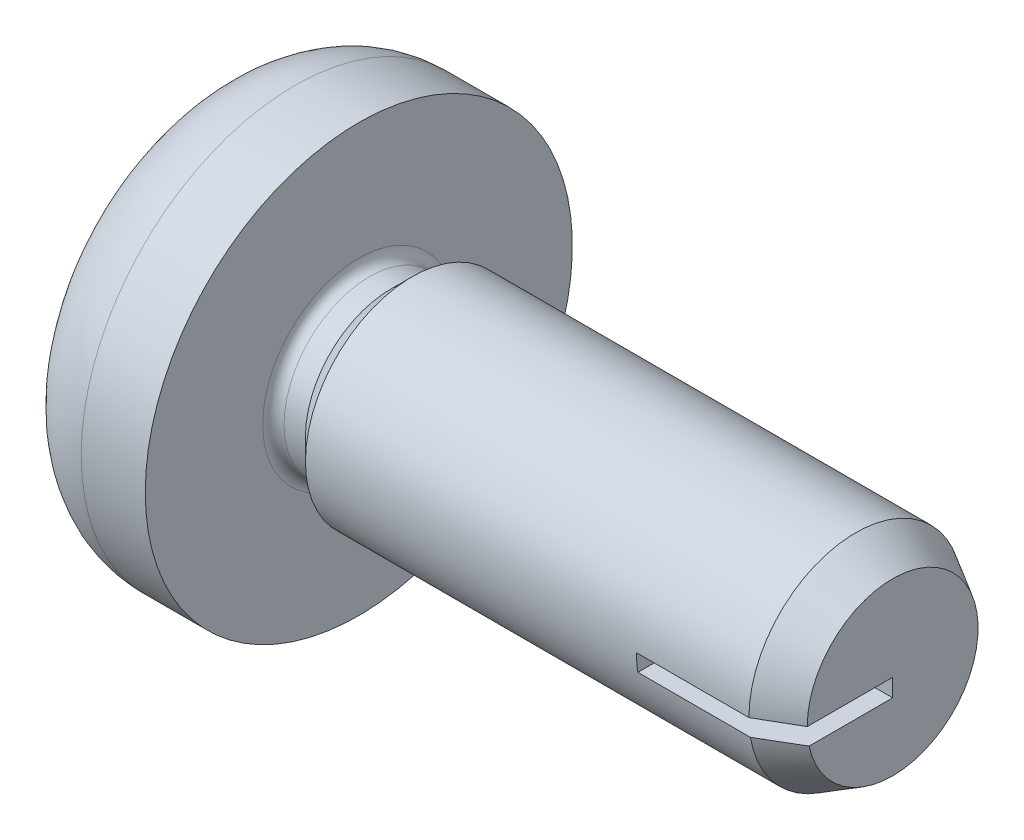
ISO-10303-21;
HEADER;
FILE_DESCRIPTION(('STEP AP214'),'2;1');
FILE_NAME('part.step','',(''),(''),'','','');
FILE_SCHEMA(('AUTOMOTIVE_DESIGN { 1 0 10303 214 1 1 1 1 }'));
ENDSEC;
DATA;
#1=APPLICATION_CONTEXT('core data for automotive mechanical design processes');
#2=APPLICATION_PROTOCOL_DEFINITION('international standard','automotive_design',2000,#1);
#3=PRODUCT_CONTEXT('',#1,'mechanical');
#4=PRODUCT('Part','Part','',(#3));
#5=PRODUCT_RELATED_PRODUCT_CATEGORY('part','',(#4));
#6=PRODUCT_DEFINITION_FORMATION('','',#4);
#7=PRODUCT_DEFINITION_CONTEXT('part definition',#1,'design');
#8=PRODUCT_DEFINITION('design','',#6,#7);
#9=PRODUCT_DEFINITION_SHAPE('','',#8);
#10=(LENGTH_UNIT() NAMED_UNIT(*) SI_UNIT(.MILLI.,.METRE.));
#11=(NAMED_UNIT(*) PLANE_ANGLE_UNIT() SI_UNIT($,.RADIAN.));
#12=(NAMED_UNIT(*) SI_UNIT($,.STERADIAN.) SOLID_ANGLE_UNIT());
#13=UNCERTAINTY_MEASURE_WITH_UNIT(LENGTH_MEASURE(1.E-05),#10,'distance_accuracy_value','');
#14=(GEOMETRIC_REPRESENTATION_CONTEXT(3) GLOBAL_UNCERTAINTY_ASSIGNED_CONTEXT((#13)) GLOBAL_UNIT_ASSIGNED_CONTEXT((#10,
#11,#12)) REPRESENTATION_CONTEXT('',''));
#15=CARTESIAN_POINT('',(0.,0.,0.));
#16=DIRECTION('',(0.,0.,1.));
#17=DIRECTION('',(1.,0.,0.));
#18=AXIS2_PLACEMENT_3D('',#15,#16,#17);
#19=CARTESIAN_POINT('',(0.,0.,0.));
#20=DIRECTION('',(-1.,0.,0.));
#21=DIRECTION('',(0.,0.,1.));
#22=AXIS2_PLACEMENT_3D('',#19,#20,#21);
#23=CYLINDRICAL_SURFACE('',#22,4.);
#24=CARTESIAN_POINT('',(7.6,0.,0.));
#25=DIRECTION('',(-1.,0.,0.));
#26=DIRECTION('',(0.,0.,1.));
#27=AXIS2_PLACEMENT_3D('',#24,#25,#26);
#28=CIRCLE('',#27,4.);
#29=CARTESIAN_POINT('',(7.6,0.,4.));
#30=VERTEX_POINT('',#29);
#31=EDGE_CURVE('E232',#30,#30,#28,.T.);
#32=ORIENTED_EDGE('',*,*,#31,.F.);
#33=EDGE_LOOP('',(#32));
#34=FACE_BOUND('',#33,.T.);
#35=DIRECTION('',(-1.,0.,0.));
#36=VECTOR('',#35,1.);
#37=CARTESIAN_POINT('',(0.,0.,4.));
#38=LINE('',#37,#36);
#39=CARTESIAN_POINT('',(24.2143593539449,0.,4.));
#40=VERTEX_POINT('',#39);
#41=CARTESIAN_POINT('',(20.,0.,4.));
#42=VERTEX_POINT('',#41);
#43=EDGE_CURVE('E374',#40,#42,#38,.T.);
#44=ORIENTED_EDGE('',*,*,#43,.F.);
#45=CARTESIAN_POINT('',(24.2143593539449,0.,0.));
#46=DIRECTION('',(-1.,0.,0.));
#47=DIRECTION('',(0.,0.,1.));
#48=AXIS2_PLACEMENT_3D('',#45,#46,#47);
#49=CIRCLE('',#48,4.);
#50=CARTESIAN_POINT('',(24.2143593539449,-0.666666666666667,3.94405318873308));
#51=VERTEX_POINT('',#50);
#52=EDGE_CURVE('E371',#40,#51,#49,.T.);
#53=ORIENTED_EDGE('',*,*,#52,.T.);
#54=DIRECTION('',(-1.,0.,0.));
#55=VECTOR('',#54,1.);
#56=CARTESIAN_POINT('',(0.,-0.66666666666667,3.94405318873308));
#57=LINE('',#56,#55);
#58=CARTESIAN_POINT('',(20.,-0.666666666666667,3.94405318873308));
#59=VERTEX_POINT('',#58);
#60=EDGE_CURVE('E378',#59,#51,#57,.F.);
#61=ORIENTED_EDGE('',*,*,#60,.F.);
#62=CARTESIAN_POINT('',(20.,0.,0.));
#63=DIRECTION('',(1.,0.,0.));
#64=DIRECTION('',(0.,0.,-1.));
#65=AXIS2_PLACEMENT_3D('',#62,#63,#64);
#66=CIRCLE('',#65,4.);
#67=EDGE_CURVE('E42',#42,#59,#66,.T.);
#68=ORIENTED_EDGE('',*,*,#67,.F.);
#69=EDGE_LOOP('',(#44,#53,#61,#68));
#70=FACE_BOUND('',#69,.T.);
#71=ADVANCED_FACE('F68',(#34,#70),#23,.T.);
#72=CARTESIAN_POINT('',(24.2143593539449,0.,0.));
#73=DIRECTION('',(-1.,0.,0.));
#74=DIRECTION('',(0.,0.,1.));
#75=AXIS2_PLACEMENT_3D('',#72,#73,#74);
#76=CONICAL_SURFACE('',#75,4.,0.523598775598293);
#77=ORIENTED_EDGE('',*,*,#52,.F.);
#78=DIRECTION('',(-0.866025403784441,0.,0.499999999999995));
#79=VECTOR('',#78,1.);
#80=CARTESIAN_POINT('',(31.1425625842205,0.,0.));
#81=LINE('',#80,#79);
#82=CARTESIAN_POINT('',(25.6,0.,3.2));
#83=VERTEX_POINT('',#82);
#84=EDGE_CURVE('E376',#40,#83,#81,.F.);
#85=ORIENTED_EDGE('',*,*,#84,.T.);
#86=CARTESIAN_POINT('',(25.6,0.,0.));
#87=DIRECTION('',(-1.,0.,0.));
#88=DIRECTION('',(0.,0.,1.));
#89=AXIS2_PLACEMENT_3D('',#86,#87,#88);
#90=CIRCLE('',#89,3.2);
#91=CARTESIAN_POINT('',(25.6,-0.666666666666667,3.12978522514813));
#92=VERTEX_POINT('',#91);
#93=EDGE_CURVE('E230',#83,#92,#90,.T.);
#94=ORIENTED_EDGE('',*,*,#93,.T.);
#95=CARTESIAN_POINT('',(29.0110225737498,-0.666666666666666,1.03442890570983));
#96=CARTESIAN_POINT('',(28.9546047360862,-0.666666666666666,1.07316230279422));
#97=CARTESIAN_POINT('',(28.8979084191792,-0.666666666666666,1.11148539170131));
#98=CARTESIAN_POINT('',(28.7840766646169,-0.666666666666666,1.18746837836424));
#99=CARTESIAN_POINT('',(28.7269412485431,-0.666666666666666,1.2251283084183));
#100=CARTESIAN_POINT('',(28.6123511503539,-0.666666666666666,1.29994122551413));
#101=CARTESIAN_POINT('',(28.5548965113001,-0.666666666666666,1.33709427870162));
#102=CARTESIAN_POINT('',(28.4397288887015,-0.666666666666666,1.4109992706103));
#103=CARTESIAN_POINT('',(28.3820159015085,-0.666666666666666,1.44775120364183));
#104=CARTESIAN_POINT('',(28.2085999099586,-0.666666666666666,1.55751052864889));
#105=CARTESIAN_POINT('',(28.0925936030097,-0.666666666666666,1.63003848501712));
#106=CARTESIAN_POINT('',(27.860039620016,-0.666666666666666,1.77422946995291));
#107=CARTESIAN_POINT('',(27.7434919213131,-0.666666666666666,1.84589246186038));
#108=CARTESIAN_POINT('',(27.4030460845038,-0.666666666666666,2.05400292151073));
#109=CARTESIAN_POINT('',(27.1786501670723,-0.666666666666666,2.18963540679999));
#110=CARTESIAN_POINT('',(26.7291021401079,-0.666666666666666,2.45963129973836));
#111=CARTESIAN_POINT('',(26.5039500382249,-0.666666666666667,2.59399472017408));
#112=CARTESIAN_POINT('',(26.0531203270533,-0.666666666666667,2.8619414023947));
#113=CARTESIAN_POINT('',(25.827442620258,-0.666666666666667,2.99552450006476));
#114=CARTESIAN_POINT('',(25.3757682789441,-0.666666666666667,3.26215053511295));
#115=CARTESIAN_POINT('',(25.1497716440183,-0.666666666666667,3.39519347180053));
#116=CARTESIAN_POINT('',(24.5796331830894,-0.666666666666667,3.7301906718806));
#117=CARTESIAN_POINT('',(24.2353456495235,-0.666666666666667,3.93189688810902));
#118=CARTESIAN_POINT('',(23.5464530535666,-0.666666666666667,4.33476598611254));
#119=CARTESIAN_POINT('',(23.2018479911485,-0.666666666666667,4.53592886784144));
#120=CARTESIAN_POINT('',(22.5125601596137,-0.666666666666667,4.93781254608102));
#121=CARTESIAN_POINT('',(22.1678774731129,-0.666666666666667,5.13853348432239));
#122=CARTESIAN_POINT('',(21.4783597959243,-0.666666666666667,5.53971245147009));
#123=CARTESIAN_POINT('',(21.1335248054617,-0.666666666666667,5.74017048076359));
#124=CARTESIAN_POINT('',(20.7886429402508,-0.666666666666667,5.94054763638404));
#125=B_SPLINE_CURVE_WITH_KNOTS('',3,(#95,#96,#97,#98,#99,#100,#101,#102,#103,#104,#105,#106,
#107,#108,#109,#110,#111,#112,#113,#114,#115,#116,#117,#118,#119,#120,#121,#122,#123,#124),
.UNSPECIFIED.,.F.,.F.,(4,2,2,2,2,2,2,2,2,2,2,2,2,2,4),(0.,0.205297188000722,0.410584349476788,
0.615844460372576,0.821107478990559,1.23153958067164,1.64198901718691,2.42858471812644,
3.21517248516027,4.00192012329788,4.78866876690041,5.98573664629052,7.18280462748484,
8.37940611176341,9.57600583190403),.UNSPECIFIED.);
#126=EDGE_CURVE('E380',#92,#51,#125,.T.);
#127=ORIENTED_EDGE('',*,*,#126,.T.);
#128=EDGE_LOOP('',(#77,#85,#94,#127));
#129=FACE_BOUND('',#128,.T.);
#130=ADVANCED_FACE('F389',(#129),#76,.T.);
#131=CARTESIAN_POINT('',(25.6,4.,0.));
#132=DIRECTION('',(-1.,0.,0.));
#133=DIRECTION('',(0.,0.,1.));
#134=AXIS2_PLACEMENT_3D('',#131,#132,#133);
#135=PLANE('',#134);
#136=DIRECTION('',(0.,0.,1.));
#137=VECTOR('',#136,1.);
#138=CARTESIAN_POINT('',(25.6,0.,0.));
#139=LINE('',#138,#137);
#140=CARTESIAN_POINT('',(25.6,0.,0.));
#141=VERTEX_POINT('',#140);
#142=EDGE_CURVE('E76',#141,#83,#139,.T.);
#143=ORIENTED_EDGE('',*,*,#142,.F.);
#144=DIRECTION('',(0.,1.,0.));
#145=VECTOR('',#144,1.);
#146=CARTESIAN_POINT('',(25.6,0.,0.));
#147=LINE('',#146,#145);
#148=CARTESIAN_POINT('',(25.6,-0.666666666666668,0.));
#149=VERTEX_POINT('',#148);
#150=EDGE_CURVE('E220',#149,#141,#147,.T.);
#151=ORIENTED_EDGE('',*,*,#150,.F.);
#152=DIRECTION('',(0.,0.,-1.));
#153=VECTOR('',#152,1.);
#154=CARTESIAN_POINT('',(25.6,-0.666666666666667,0.));
#155=LINE('',#154,#153);
#156=EDGE_CURVE('E231',#92,#149,#155,.T.);
#157=ORIENTED_EDGE('',*,*,#156,.F.);
#158=ORIENTED_EDGE('',*,*,#93,.F.);
#159=EDGE_LOOP('',(#143,#151,#157,#158));
#160=FACE_BOUND('',#159,.T.);
#161=ADVANCED_FACE('F228',(#160),#135,.F.);
#162=CARTESIAN_POINT('',(0.,0.,0.));
#163=DIRECTION('',(1.,0.,0.));
#164=DIRECTION('',(0.,0.,-1.));
#165=AXIS2_PLACEMENT_3D('',#162,#163,#164);
#166=PLANE('',#165);
#167=CARTESIAN_POINT('',(0.,0.,0.));
#168=DIRECTION('',(-1.,0.,0.));
#169=DIRECTION('',(0.,0.,1.));
#170=AXIS2_PLACEMENT_3D('',#167,#168,#169);
#171=CIRCLE('',#170,4.8);
#172=CARTESIAN_POINT('',(0.,0.,4.8));
#173=VERTEX_POINT('',#172);
#174=EDGE_CURVE('E258',#173,#173,#171,.T.);
#175=ORIENTED_EDGE('',*,*,#174,.T.);
#176=EDGE_LOOP('',(#175));
#177=FACE_BOUND('',#176,.T.);
#178=DIRECTION('',(0.,0.,-1.));
#179=VECTOR('',#178,1.);
#180=CARTESIAN_POINT('',(0.,-0.9,0.899999999999999));
#181=LINE('',#180,#179);
#182=CARTESIAN_POINT('',(0.,-0.9,4.39));
#183=VERTEX_POINT('',#182);
#184=CARTESIAN_POINT('',(0.,-0.899999999999999,1.778));
#185=VERTEX_POINT('',#184);
#186=EDGE_CURVE('E307',#183,#185,#181,.T.);
#187=ORIENTED_EDGE('',*,*,#186,.T.);
#188=DIRECTION('',(0.,0.707106781186548,0.707106781186547));
#189=VECTOR('',#188,1.);
#190=CARTESIAN_POINT('',(0.,-1.778,0.9));
#191=LINE('',#190,#189);
#192=CARTESIAN_POINT('',(0.,-1.778,0.9));
#193=VERTEX_POINT('',#192);
#194=EDGE_CURVE('E366',#193,#185,#191,.T.);
#195=ORIENTED_EDGE('',*,*,#194,.F.);
#196=DIRECTION('',(0.,-1.,0.));
#197=VECTOR('',#196,1.);
#198=CARTESIAN_POINT('',(0.,-0.9,0.899999999999999));
#199=LINE('',#198,#197);
#200=CARTESIAN_POINT('',(0.,-4.39,0.9));
#201=VERTEX_POINT('',#200);
#202=EDGE_CURVE('E305',#193,#201,#199,.T.);
#203=ORIENTED_EDGE('',*,*,#202,.T.);
#204=DIRECTION('',(0.,0.,-1.));
#205=VECTOR('',#204,1.);
#206=CARTESIAN_POINT('',(0.,-4.39,-0.9));
#207=LINE('',#206,#205);
#208=CARTESIAN_POINT('',(0.,-4.39,-0.9));
#209=VERTEX_POINT('',#208);
#210=EDGE_CURVE('E302',#201,#209,#207,.T.);
#211=ORIENTED_EDGE('',*,*,#210,.T.);
#212=DIRECTION('',(0.,1.,0.));
#213=VECTOR('',#212,1.);
#214=CARTESIAN_POINT('',(0.,-0.9,-0.9));
#215=LINE('',#214,#213);
#216=CARTESIAN_POINT('',(0.,-1.778,-0.9));
#217=VERTEX_POINT('',#216);
#218=EDGE_CURVE('E299',#209,#217,#215,.T.);
#219=ORIENTED_EDGE('',*,*,#218,.T.);
#220=DIRECTION('',(0.,-0.707106781186548,0.707106781186547));
#221=VECTOR('',#220,1.);
#222=CARTESIAN_POINT('',(0.,-1.778,-0.9));
#223=LINE('',#222,#221);
#224=CARTESIAN_POINT('',(0.,-0.899999999999999,-1.778));
#225=VERTEX_POINT('',#224);
#226=EDGE_CURVE('E357',#225,#217,#223,.T.);
#227=ORIENTED_EDGE('',*,*,#226,.F.);
#228=DIRECTION('',(0.,0.,-1.));
#229=VECTOR('',#228,1.);
#230=CARTESIAN_POINT('',(0.,-0.9,-4.39));
#231=LINE('',#230,#229);
#232=CARTESIAN_POINT('',(0.,-0.9,-4.39));
#233=VERTEX_POINT('',#232);
#234=EDGE_CURVE('E297',#225,#233,#231,.T.);
#235=ORIENTED_EDGE('',*,*,#234,.T.);
#236=DIRECTION('',(0.,1.,0.));
#237=VECTOR('',#236,1.);
#238=CARTESIAN_POINT('',(0.,0.9,-4.39));
#239=LINE('',#238,#237);
#240=CARTESIAN_POINT('',(0.,0.9,-4.39));
#241=VERTEX_POINT('',#240);
#242=EDGE_CURVE('E294',#233,#241,#239,.T.);
#243=ORIENTED_EDGE('',*,*,#242,.T.);
#244=DIRECTION('',(0.,0.,1.));
#245=VECTOR('',#244,1.);
#246=CARTESIAN_POINT('',(0.,0.9,-4.39));
#247=LINE('',#246,#245);
#248=CARTESIAN_POINT('',(0.,0.9,-1.778));
#249=VERTEX_POINT('',#248);
#250=EDGE_CURVE('E291',#241,#249,#247,.T.);
#251=ORIENTED_EDGE('',*,*,#250,.T.);
#252=DIRECTION('',(0.,-0.707106781186548,-0.707106781186547));
#253=VECTOR('',#252,1.);
#254=CARTESIAN_POINT('',(0.,1.778,-0.9));
#255=LINE('',#254,#253);
#256=CARTESIAN_POINT('',(0.,1.778,-0.9));
#257=VERTEX_POINT('',#256);
#258=EDGE_CURVE('E349',#257,#249,#255,.T.);
#259=ORIENTED_EDGE('',*,*,#258,.F.);
#260=DIRECTION('',(0.,1.,0.));
#261=VECTOR('',#260,1.);
#262=CARTESIAN_POINT('',(0.,4.39,-0.9));
#263=LINE('',#262,#261);
#264=CARTESIAN_POINT('',(0.,4.39,-0.9));
#265=VERTEX_POINT('',#264);
#266=EDGE_CURVE('E321',#257,#265,#263,.T.);
#267=ORIENTED_EDGE('',*,*,#266,.T.);
#268=DIRECTION('',(0.,0.,1.));
#269=VECTOR('',#268,1.);
#270=CARTESIAN_POINT('',(0.,4.39,-0.9));
#271=LINE('',#270,#269);
#272=CARTESIAN_POINT('',(0.,4.39,0.9));
#273=VERTEX_POINT('',#272);
#274=EDGE_CURVE('E318',#265,#273,#271,.T.);
#275=ORIENTED_EDGE('',*,*,#274,.T.);
#276=DIRECTION('',(0.,-1.,0.));
#277=VECTOR('',#276,1.);
#278=CARTESIAN_POINT('',(0.,4.39,0.9));
#279=LINE('',#278,#277);
#280=CARTESIAN_POINT('',(0.,1.778,0.9));
#281=VERTEX_POINT('',#280);
#282=EDGE_CURVE('E315',#273,#281,#279,.T.);
#283=ORIENTED_EDGE('',*,*,#282,.T.);
#284=DIRECTION('',(0.,0.707106781186548,-0.707106781186547));
#285=VECTOR('',#284,1.);
#286=CARTESIAN_POINT('',(0.,1.778,0.9));
#287=LINE('',#286,#285);
#288=CARTESIAN_POINT('',(0.,0.9,1.778));
#289=VERTEX_POINT('',#288);
#290=EDGE_CURVE('E339',#289,#281,#287,.T.);
#291=ORIENTED_EDGE('',*,*,#290,.F.);
#292=DIRECTION('',(0.,0.,1.));
#293=VECTOR('',#292,1.);
#294=CARTESIAN_POINT('',(0.,0.9,0.9));
#295=LINE('',#294,#293);
#296=CARTESIAN_POINT('',(0.,0.9,4.39));
#297=VERTEX_POINT('',#296);
#298=EDGE_CURVE('E313',#289,#297,#295,.T.);
#299=ORIENTED_EDGE('',*,*,#298,.T.);
#300=DIRECTION('',(0.,-1.,0.));
#301=VECTOR('',#300,1.);
#302=CARTESIAN_POINT('',(0.,0.9,4.39));
#303=LINE('',#302,#301);
#304=EDGE_CURVE('E310',#297,#183,#303,.T.);
#305=ORIENTED_EDGE('',*,*,#304,.T.);
#306=EDGE_LOOP('',(#187,#195,#203,#211,#219,#227,#235,#243,#251,#259,#267,#275,#283,#291,#299,#305));
#307=FACE_BOUND('',#306,.T.);
#308=ADVANCED_FACE('F421',(#177,#307),#166,.F.);
#309=CARTESIAN_POINT('',(7.6,0.,0.));
#310=DIRECTION('',(1.,0.,0.));
#311=DIRECTION('',(0.,0.,-1.));
#312=AXIS2_PLACEMENT_3D('',#309,#310,#311);
#313=CONICAL_SURFACE('',#312,4.,0.78539816339745);
#314=CARTESIAN_POINT('',(6.8,0.,0.));
#315=DIRECTION('',(-1.,0.,0.));
#316=DIRECTION('',(0.,0.,1.));
#317=AXIS2_PLACEMENT_3D('',#314,#315,#316);
#318=CIRCLE('',#317,3.2);
#319=CARTESIAN_POINT('',(6.8,0.,3.2));
#320=VERTEX_POINT('',#319);
#321=EDGE_CURVE('E274',#320,#320,#318,.T.);
#322=ORIENTED_EDGE('',*,*,#321,.F.);
#323=EDGE_LOOP('',(#322));
#324=FACE_BOUND('',#323,.T.);
#325=ORIENTED_EDGE('',*,*,#31,.T.);
#326=EDGE_LOOP('',(#325));
#327=FACE_BOUND('',#326,.T.);
#328=ADVANCED_FACE('F417',(#324,#327),#313,.T.);
#329=CARTESIAN_POINT('',(0.,0.,0.));
#330=DIRECTION('',(-1.,0.,0.));
#331=DIRECTION('',(0.,0.,1.));
#332=AXIS2_PLACEMENT_3D('',#329,#330,#331);
#333=CYLINDRICAL_SURFACE('',#332,3.2);
#334=CARTESIAN_POINT('',(6.,0.,0.));
#335=DIRECTION('',(-1.,0.,0.));
#336=DIRECTION('',(0.,0.,1.));
#337=AXIS2_PLACEMENT_3D('',#334,#335,#336);
#338=CIRCLE('',#337,3.2);
#339=CARTESIAN_POINT('',(6.,0.,3.2));
#340=VERTEX_POINT('',#339);
#341=EDGE_CURVE('E277',#340,#340,#338,.T.);
#342=ORIENTED_EDGE('',*,*,#341,.F.);
#343=EDGE_LOOP('',(#342));
#344=FACE_BOUND('',#343,.T.);
#345=ORIENTED_EDGE('',*,*,#321,.T.);
#346=EDGE_LOOP('',(#345));
#347=FACE_BOUND('',#346,.T.);
#348=ADVANCED_FACE('F544',(#344,#347),#333,.T.);
#349=CARTESIAN_POINT('',(6.,0.,0.));
#350=DIRECTION('',(-1.,0.,0.));
#351=DIRECTION('',(0.,0.,1.));
#352=AXIS2_PLACEMENT_3D('',#349,#350,#351);
#353=TOROIDAL_SURFACE('',#352,3.6,0.400000000000001);
#354=CARTESIAN_POINT('',(5.6,0.,0.));
#355=DIRECTION('',(-1.,0.,0.));
#356=DIRECTION('',(0.,0.,1.));
#357=AXIS2_PLACEMENT_3D('',#354,#355,#356);
#358=CIRCLE('',#357,3.6);
#359=CARTESIAN_POINT('',(5.6,0.,3.6));
#360=VERTEX_POINT('',#359);
#361=EDGE_CURVE('E280',#360,#360,#358,.T.);
#362=ORIENTED_EDGE('',*,*,#361,.F.);
#363=EDGE_LOOP('',(#362));
#364=FACE_BOUND('',#363,.T.);
#365=ORIENTED_EDGE('',*,*,#341,.T.);
#366=EDGE_LOOP('',(#365));
#367=FACE_BOUND('',#366,.T.);
#368=ADVANCED_FACE('F541',(#364,#367),#353,.F.);
#369=CARTESIAN_POINT('',(5.6,8.,0.));
#370=DIRECTION('',(-1.,0.,0.));
#371=DIRECTION('',(0.,0.,1.));
#372=AXIS2_PLACEMENT_3D('',#369,#370,#371);
#373=PLANE('',#372);
#374=CARTESIAN_POINT('',(5.6,0.,0.));
#375=DIRECTION('',(-1.,0.,0.));
#376=DIRECTION('',(0.,0.,1.));
#377=AXIS2_PLACEMENT_3D('',#374,#375,#376);
#378=CIRCLE('',#377,8.);
#379=CARTESIAN_POINT('',(5.6,0.,8.));
#380=VERTEX_POINT('',#379);
#381=EDGE_CURVE('E283',#380,#380,#378,.T.);
#382=ORIENTED_EDGE('',*,*,#381,.F.);
#383=EDGE_LOOP('',(#382));
#384=FACE_BOUND('',#383,.T.);
#385=ORIENTED_EDGE('',*,*,#361,.T.);
#386=EDGE_LOOP('',(#385));
#387=FACE_BOUND('',#386,.T.);
#388=ADVANCED_FACE('F537',(#384,#387),#373,.F.);
#389=CARTESIAN_POINT('',(0.,0.,0.));
#390=DIRECTION('',(-1.,0.,0.));
#391=DIRECTION('',(0.,0.,1.));
#392=AXIS2_PLACEMENT_3D('',#389,#390,#391);
#393=CYLINDRICAL_SURFACE('',#392,8.);
#394=CARTESIAN_POINT('',(3.2,0.,0.));
#395=DIRECTION('',(-1.,0.,0.));
#396=DIRECTION('',(0.,0.,1.));
#397=AXIS2_PLACEMENT_3D('',#394,#395,#396);
#398=CIRCLE('',#397,8.);
#399=CARTESIAN_POINT('',(3.2,0.,8.));
#400=VERTEX_POINT('',#399);
#401=EDGE_CURVE('E286',#400,#400,#398,.T.);
#402=ORIENTED_EDGE('',*,*,#401,.F.);
#403=EDGE_LOOP('',(#402));
#404=FACE_BOUND('',#403,.T.);
#405=ORIENTED_EDGE('',*,*,#381,.T.);
#406=EDGE_LOOP('',(#405));
#407=FACE_BOUND('',#406,.T.);
#408=ADVANCED_FACE('F533',(#404,#407),#393,.T.);
#409=CARTESIAN_POINT('',(3.2,0.,0.));
#410=DIRECTION('',(-1.,0.,0.));
#411=DIRECTION('',(0.,0.,1.));
#412=AXIS2_PLACEMENT_3D('',#409,#410,#411);
#413=TOROIDAL_SURFACE('',#412,4.8,3.2);
#414=ORIENTED_EDGE('',*,*,#174,.F.);
#415=EDGE_LOOP('',(#414));
#416=FACE_BOUND('',#415,.T.);
#417=ORIENTED_EDGE('',*,*,#401,.T.);
#418=EDGE_LOOP('',(#417));
#419=FACE_BOUND('',#418,.T.);
#420=ADVANCED_FACE('F527',(#416,#419),#413,.T.);
#421=CARTESIAN_POINT('',(4.,4.39,-0.9));
#422=DIRECTION('',(0.,0.,1.));
#423=DIRECTION('',(1.,0.,0.));
#424=AXIS2_PLACEMENT_3D('',#421,#422,#423);
#425=PLANE('',#424);
#426=DIRECTION('',(-1.,0.,0.));
#427=VECTOR('',#426,1.);
#428=CARTESIAN_POINT('',(5.24167950776358,1.778,-0.9));
#429=LINE('',#428,#427);
#430=CARTESIAN_POINT('',(4.,1.778,-0.9));
#431=VERTEX_POINT('',#430);
#432=EDGE_CURVE('E347',#431,#257,#429,.T.);
#433=ORIENTED_EDGE('',*,*,#432,.F.);
#434=DIRECTION('',(0.,1.,0.));
#435=VECTOR('',#434,1.);
#436=CARTESIAN_POINT('',(4.,4.39,-0.9));
#437=LINE('',#436,#435);
#438=CARTESIAN_POINT('',(4.,2.93411906293519,-0.9));
#439=VERTEX_POINT('',#438);
#440=EDGE_CURVE('E262',#431,#439,#437,.T.);
#441=ORIENTED_EDGE('',*,*,#440,.T.);
#442=DIRECTION('',(-0.939692620785908,0.342020143325669,0.));
#443=VECTOR('',#442,1.);
#444=CARTESIAN_POINT('',(0.,4.39,-0.9));
#445=LINE('',#444,#443);
#446=EDGE_CURVE('E255',#439,#265,#445,.T.);
#447=ORIENTED_EDGE('',*,*,#446,.T.);
#448=ORIENTED_EDGE('',*,*,#266,.F.);
#449=EDGE_LOOP('',(#433,#441,#447,#448));
#450=FACE_BOUND('',#449,.T.);
#451=ADVANCED_FACE('F494',(#450),#425,.T.);
#452=CARTESIAN_POINT('',(0.,4.39,-0.9));
#453=DIRECTION('',(-0.342020143325669,-0.939692620785908,0.));
#454=DIRECTION('',(0.939692620785908,-0.342020143325669,0.));
#455=AXIS2_PLACEMENT_3D('',#452,#453,#454);
#456=PLANE('',#455);
#457=ORIENTED_EDGE('',*,*,#274,.F.);
#458=ORIENTED_EDGE('',*,*,#446,.F.);
#459=DIRECTION('',(0.,0.,1.));
#460=VECTOR('',#459,1.);
#461=CARTESIAN_POINT('',(4.,2.93411906293519,-0.9));
#462=LINE('',#461,#460);
#463=CARTESIAN_POINT('',(4.,2.93411906293519,0.9));
#464=VERTEX_POINT('',#463);
#465=EDGE_CURVE('E259',#439,#464,#462,.T.);
#466=ORIENTED_EDGE('',*,*,#465,.T.);
#467=DIRECTION('',(-0.939692620785908,0.342020143325669,0.));
#468=VECTOR('',#467,1.);
#469=CARTESIAN_POINT('',(3.53208888623795,3.10442478062692,0.9));
#470=LINE('',#469,#468);
#471=EDGE_CURVE('E249',#464,#273,#470,.T.);
#472=ORIENTED_EDGE('',*,*,#471,.T.);
#473=EDGE_LOOP('',(#457,#458,#466,#472));
#474=FACE_BOUND('',#473,.T.);
#475=ADVANCED_FACE('F70',(#474),#456,.T.);
#476=CARTESIAN_POINT('',(4.,4.39,0.9));
#477=DIRECTION('',(0.,0.,-1.));
#478=DIRECTION('',(0.,1.,0.));
#479=AXIS2_PLACEMENT_3D('',#476,#477,#478);
#480=PLANE('',#479);
#481=DIRECTION('',(-1.,0.,0.));
#482=VECTOR('',#481,1.);
#483=CARTESIAN_POINT('',(5.24167950776358,1.778,0.9));
#484=LINE('',#483,#482);
#485=CARTESIAN_POINT('',(4.,1.778,0.9));
#486=VERTEX_POINT('',#485);
#487=EDGE_CURVE('E338',#486,#281,#484,.T.);
#488=ORIENTED_EDGE('',*,*,#487,.T.);
#489=ORIENTED_EDGE('',*,*,#282,.F.);
#490=ORIENTED_EDGE('',*,*,#471,.F.);
#491=DIRECTION('',(0.,-1.,0.));
#492=VECTOR('',#491,1.);
#493=CARTESIAN_POINT('',(4.,4.39,0.9));
#494=LINE('',#493,#492);
#495=EDGE_CURVE('E261',#464,#486,#494,.T.);
#496=ORIENTED_EDGE('',*,*,#495,.T.);
#497=EDGE_LOOP('',(#488,#489,#490,#496));
#498=FACE_BOUND('',#497,.T.);
#499=ADVANCED_FACE('F444',(#498),#480,.T.);
#500=CARTESIAN_POINT('',(4.,0.9,0.9));
#501=DIRECTION('',(0.,-1.,0.));
#502=DIRECTION('',(0.,0.,-1.));
#503=AXIS2_PLACEMENT_3D('',#500,#501,#502);
#504=PLANE('',#503);
#505=DIRECTION('',(-1.,0.,0.));
#506=VECTOR('',#505,1.);
#507=CARTESIAN_POINT('',(5.24167950776358,0.9,1.778));
#508=LINE('',#507,#506);
#509=CARTESIAN_POINT('',(4.,0.9,1.778));
#510=VERTEX_POINT('',#509);
#511=EDGE_CURVE('E336',#510,#289,#508,.T.);
#512=ORIENTED_EDGE('',*,*,#511,.F.);
#513=DIRECTION('',(0.,0.,1.));
#514=VECTOR('',#513,1.);
#515=CARTESIAN_POINT('',(4.,0.9,0.9));
#516=LINE('',#515,#514);
#517=CARTESIAN_POINT('',(4.,0.9,2.93411906293519));
#518=VERTEX_POINT('',#517);
#519=EDGE_CURVE('E253',#510,#518,#516,.T.);
#520=ORIENTED_EDGE('',*,*,#519,.T.);
#521=DIRECTION('',(-0.939692620785908,0.,0.342020143325669));
#522=VECTOR('',#521,1.);
#523=CARTESIAN_POINT('',(0.,0.9,4.39));
#524=LINE('',#523,#522);
#525=EDGE_CURVE('E246',#518,#297,#524,.T.);
#526=ORIENTED_EDGE('',*,*,#525,.T.);
#527=ORIENTED_EDGE('',*,*,#298,.F.);
#528=EDGE_LOOP('',(#512,#520,#526,#527));
#529=FACE_BOUND('',#528,.T.);
#530=ADVANCED_FACE('F436',(#529),#504,.T.);
#531=CARTESIAN_POINT('',(0.,0.9,4.39));
#532=DIRECTION('',(-0.342020143325669,0.,-0.939692620785908));
#533=DIRECTION('',(-0.939692620785908,0.,0.342020143325669));
#534=AXIS2_PLACEMENT_3D('',#531,#532,#533);
#535=PLANE('',#534);
#536=ORIENTED_EDGE('',*,*,#304,.F.);
#537=ORIENTED_EDGE('',*,*,#525,.F.);
#538=DIRECTION('',(0.,-1.,0.));
#539=VECTOR('',#538,1.);
#540=CARTESIAN_POINT('',(4.,0.9,2.93411906293519));
#541=LINE('',#540,#539);
#542=CARTESIAN_POINT('',(4.,-0.9,2.93411906293519));
#543=VERTEX_POINT('',#542);
#544=EDGE_CURVE('E250',#518,#543,#541,.T.);
#545=ORIENTED_EDGE('',*,*,#544,.T.);
#546=DIRECTION('',(-0.939692620785908,0.,0.342020143325669));
#547=VECTOR('',#546,1.);
#548=CARTESIAN_POINT('',(4.65375326514097,-0.9,2.69617233386953));
#549=LINE('',#548,#547);
#550=EDGE_CURVE('E238',#543,#183,#549,.T.);
#551=ORIENTED_EDGE('',*,*,#550,.T.);
#552=EDGE_LOOP('',(#536,#537,#545,#551));
#553=FACE_BOUND('',#552,.T.);
#554=ADVANCED_FACE('F433',(#553),#535,.T.);
#555=CARTESIAN_POINT('',(4.,-0.9,0.899999999999999));
#556=DIRECTION('',(0.,1.,0.));
#557=DIRECTION('',(0.,0.,1.));
#558=AXIS2_PLACEMENT_3D('',#555,#556,#557);
#559=PLANE('',#558);
#560=DIRECTION('',(-1.,0.,0.));
#561=VECTOR('',#560,1.);
#562=CARTESIAN_POINT('',(5.24167950776358,-0.899999999999999,1.778));
#563=LINE('',#562,#561);
#564=CARTESIAN_POINT('',(4.,-0.9,1.778));
#565=VERTEX_POINT('',#564);
#566=EDGE_CURVE('E363',#565,#185,#563,.T.);
#567=ORIENTED_EDGE('',*,*,#566,.T.);
#568=ORIENTED_EDGE('',*,*,#186,.F.);
#569=ORIENTED_EDGE('',*,*,#550,.F.);
#570=DIRECTION('',(0.,0.,-1.));
#571=VECTOR('',#570,1.);
#572=CARTESIAN_POINT('',(4.,-0.9,0.899999999999999));
#573=LINE('',#572,#571);
#574=EDGE_CURVE('E252',#543,#565,#573,.T.);
#575=ORIENTED_EDGE('',*,*,#574,.T.);
#576=EDGE_LOOP('',(#567,#568,#569,#575));
#577=FACE_BOUND('',#576,.T.);
#578=ADVANCED_FACE('F435',(#577),#559,.T.);
#579=CARTESIAN_POINT('',(4.,-0.9,0.899999999999999));
#580=DIRECTION('',(0.,0.,-1.));
#581=DIRECTION('',(0.,1.,0.));
#582=AXIS2_PLACEMENT_3D('',#579,#580,#581);
#583=PLANE('',#582);
#584=DIRECTION('',(-1.,0.,0.));
#585=VECTOR('',#584,1.);
#586=CARTESIAN_POINT('',(5.24167950776358,-1.778,0.9));
#587=LINE('',#586,#585);
#588=CARTESIAN_POINT('',(4.,-1.778,0.9));
#589=VERTEX_POINT('',#588);
#590=EDGE_CURVE('E364',#589,#193,#587,.T.);
#591=ORIENTED_EDGE('',*,*,#590,.F.);
#592=DIRECTION('',(0.,-1.,0.));
#593=VECTOR('',#592,1.);
#594=CARTESIAN_POINT('',(4.,-0.9,0.899999999999999));
#595=LINE('',#594,#593);
#596=CARTESIAN_POINT('',(4.,-2.93411906293519,0.9));
#597=VERTEX_POINT('',#596);
#598=EDGE_CURVE('E243',#589,#597,#595,.T.);
#599=ORIENTED_EDGE('',*,*,#598,.T.);
#600=DIRECTION('',(-0.939692620785908,-0.342020143325669,0.));
#601=VECTOR('',#600,1.);
#602=CARTESIAN_POINT('',(0.,-4.39,0.9));
#603=LINE('',#602,#601);
#604=EDGE_CURVE('E235',#597,#201,#603,.T.);
#605=ORIENTED_EDGE('',*,*,#604,.T.);
#606=ORIENTED_EDGE('',*,*,#202,.F.);
#607=EDGE_LOOP('',(#591,#599,#605,#606));
#608=FACE_BOUND('',#607,.T.);
#609=ADVANCED_FACE('F431',(#608),#583,.T.);
#610=CARTESIAN_POINT('',(0.,-4.39,-0.9));
#611=DIRECTION('',(-0.342020143325669,0.939692620785908,0.));
#612=DIRECTION('',(-0.939692620785908,-0.342020143325669,0.));
#613=AXIS2_PLACEMENT_3D('',#610,#611,#612);
#614=PLANE('',#613);
#615=ORIENTED_EDGE('',*,*,#210,.F.);
#616=ORIENTED_EDGE('',*,*,#604,.F.);
#617=DIRECTION('',(0.,0.,-1.));
#618=VECTOR('',#617,1.);
#619=CARTESIAN_POINT('',(4.,-2.93411906293519,-0.9));
#620=LINE('',#619,#618);
#621=CARTESIAN_POINT('',(4.,-2.93411906293519,-0.9));
#622=VERTEX_POINT('',#621);
#623=EDGE_CURVE('E240',#597,#622,#620,.T.);
#624=ORIENTED_EDGE('',*,*,#623,.T.);
#625=DIRECTION('',(-0.939692620785908,-0.342020143325669,0.));
#626=VECTOR('',#625,1.);
#627=CARTESIAN_POINT('',(4.65375326514097,-2.69617233386953,-0.9));
#628=LINE('',#627,#626);
#629=EDGE_CURVE('E239',#622,#209,#628,.T.);
#630=ORIENTED_EDGE('',*,*,#629,.T.);
#631=EDGE_LOOP('',(#615,#616,#624,#630));
#632=FACE_BOUND('',#631,.T.);
#633=ADVANCED_FACE('F428',(#632),#614,.T.);
#634=CARTESIAN_POINT('',(4.,-0.9,-0.9));
#635=DIRECTION('',(0.,0.,1.));
#636=DIRECTION('',(1.,0.,0.));
#637=AXIS2_PLACEMENT_3D('',#634,#635,#636);
#638=PLANE('',#637);
#639=DIRECTION('',(-1.,0.,0.));
#640=VECTOR('',#639,1.);
#641=CARTESIAN_POINT('',(5.24167950776358,-1.778,-0.9));
#642=LINE('',#641,#640);
#643=CARTESIAN_POINT('',(4.,-1.778,-0.9));
#644=VERTEX_POINT('',#643);
#645=EDGE_CURVE('E356',#644,#217,#642,.T.);
#646=ORIENTED_EDGE('',*,*,#645,.T.);
#647=ORIENTED_EDGE('',*,*,#218,.F.);
#648=ORIENTED_EDGE('',*,*,#629,.F.);
#649=DIRECTION('',(0.,1.,0.));
#650=VECTOR('',#649,1.);
#651=CARTESIAN_POINT('',(4.,-0.9,-0.9));
#652=LINE('',#651,#650);
#653=EDGE_CURVE('E242',#622,#644,#652,.T.);
#654=ORIENTED_EDGE('',*,*,#653,.T.);
#655=EDGE_LOOP('',(#646,#647,#648,#654));
#656=FACE_BOUND('',#655,.T.);
#657=ADVANCED_FACE('F430',(#656),#638,.T.);
#658=CARTESIAN_POINT('',(4.,-0.9,-4.39));
#659=DIRECTION('',(0.,1.,0.));
#660=DIRECTION('',(0.,0.,1.));
#661=AXIS2_PLACEMENT_3D('',#658,#659,#660);
#662=PLANE('',#661);
#663=DIRECTION('',(-1.,0.,0.));
#664=VECTOR('',#663,1.);
#665=CARTESIAN_POINT('',(5.24167950776358,-0.899999999999999,-1.778));
#666=LINE('',#665,#664);
#667=CARTESIAN_POINT('',(4.,-0.899999999999999,-1.778));
#668=VERTEX_POINT('',#667);
#669=EDGE_CURVE('E354',#668,#225,#666,.T.);
#670=ORIENTED_EDGE('',*,*,#669,.F.);
#671=DIRECTION('',(0.,0.,-1.));
#672=VECTOR('',#671,1.);
#673=CARTESIAN_POINT('',(4.,-0.9,-4.39));
#674=LINE('',#673,#672);
#675=CARTESIAN_POINT('',(4.,-0.9,-2.93411906293519));
#676=VERTEX_POINT('',#675);
#677=EDGE_CURVE('E270',#668,#676,#674,.T.);
#678=ORIENTED_EDGE('',*,*,#677,.T.);
#679=DIRECTION('',(-0.939692620785908,0.,-0.342020143325669));
#680=VECTOR('',#679,1.);
#681=CARTESIAN_POINT('',(0.,-0.9,-4.39));
#682=LINE('',#681,#680);
#683=EDGE_CURVE('E245',#676,#233,#682,.T.);
#684=ORIENTED_EDGE('',*,*,#683,.T.);
#685=ORIENTED_EDGE('',*,*,#234,.F.);
#686=EDGE_LOOP('',(#670,#678,#684,#685));
#687=FACE_BOUND('',#686,.T.);
#688=ADVANCED_FACE('F426',(#687),#662,.T.);
#689=CARTESIAN_POINT('',(0.,0.9,-4.39));
#690=DIRECTION('',(-0.342020143325669,0.,0.939692620785908));
#691=DIRECTION('',(0.939692620785908,0.,0.342020143325669));
#692=AXIS2_PLACEMENT_3D('',#689,#690,#691);
#693=PLANE('',#692);
#694=ORIENTED_EDGE('',*,*,#242,.F.);
#695=ORIENTED_EDGE('',*,*,#683,.F.);
#696=DIRECTION('',(0.,1.,0.));
#697=VECTOR('',#696,1.);
#698=CARTESIAN_POINT('',(4.,0.9,-2.93411906293519));
#699=LINE('',#698,#697);
#700=CARTESIAN_POINT('',(4.,0.9,-2.93411906293519));
#701=VERTEX_POINT('',#700);
#702=EDGE_CURVE('E267',#676,#701,#699,.T.);
#703=ORIENTED_EDGE('',*,*,#702,.T.);
#704=DIRECTION('',(-0.939692620785908,0.,-0.342020143325669));
#705=VECTOR('',#704,1.);
#706=CARTESIAN_POINT('',(3.53208888623795,0.9,-3.10442478062692));
#707=LINE('',#706,#705);
#708=EDGE_CURVE('E266',#701,#241,#707,.T.);
#709=ORIENTED_EDGE('',*,*,#708,.T.);
#710=EDGE_LOOP('',(#694,#695,#703,#709));
#711=FACE_BOUND('',#710,.T.);
#712=ADVANCED_FACE('F422',(#711),#693,.T.);
#713=CARTESIAN_POINT('',(4.,0.9,-4.39));
#714=DIRECTION('',(0.,-1.,0.));
#715=DIRECTION('',(0.,0.,-1.));
#716=AXIS2_PLACEMENT_3D('',#713,#714,#715);
#717=PLANE('',#716);
#718=DIRECTION('',(-1.,0.,0.));
#719=VECTOR('',#718,1.);
#720=CARTESIAN_POINT('',(5.24167950776358,0.9,-1.778));
#721=LINE('',#720,#719);
#722=CARTESIAN_POINT('',(4.,0.899999999999999,-1.778));
#723=VERTEX_POINT('',#722);
#724=EDGE_CURVE('E346',#723,#249,#721,.T.);
#725=ORIENTED_EDGE('',*,*,#724,.T.);
#726=ORIENTED_EDGE('',*,*,#250,.F.);
#727=ORIENTED_EDGE('',*,*,#708,.F.);
#728=DIRECTION('',(0.,0.,1.));
#729=VECTOR('',#728,1.);
#730=CARTESIAN_POINT('',(4.,0.9,-4.39));
#731=LINE('',#730,#729);
#732=EDGE_CURVE('E269',#701,#723,#731,.T.);
#733=ORIENTED_EDGE('',*,*,#732,.T.);
#734=EDGE_LOOP('',(#725,#726,#727,#733));
#735=FACE_BOUND('',#734,.T.);
#736=ADVANCED_FACE('F425',(#735),#717,.T.);
#737=CARTESIAN_POINT('',(4.,0.9,-0.9));
#738=DIRECTION('',(-1.,0.,0.));
#739=DIRECTION('',(0.,0.,1.));
#740=AXIS2_PLACEMENT_3D('',#737,#738,#739);
#741=PLANE('',#740);
#742=ORIENTED_EDGE('',*,*,#598,.F.);
#743=DIRECTION('',(0.,-0.707106781186548,-0.707106781186547));
#744=VECTOR('',#743,1.);
#745=CARTESIAN_POINT('',(4.,-1.778,0.9));
#746=LINE('',#745,#744);
#747=EDGE_CURVE('E91',#565,#589,#746,.T.);
#748=ORIENTED_EDGE('',*,*,#747,.F.);
#749=ORIENTED_EDGE('',*,*,#574,.F.);
#750=ORIENTED_EDGE('',*,*,#544,.F.);
#751=ORIENTED_EDGE('',*,*,#519,.F.);
#752=DIRECTION('',(0.,-0.707106781186548,0.707106781186547));
#753=VECTOR('',#752,1.);
#754=CARTESIAN_POINT('',(4.,1.778,0.9));
#755=LINE('',#754,#753);
#756=EDGE_CURVE('E323',#486,#510,#755,.T.);
#757=ORIENTED_EDGE('',*,*,#756,.F.);
#758=ORIENTED_EDGE('',*,*,#495,.F.);
#759=ORIENTED_EDGE('',*,*,#465,.F.);
#760=ORIENTED_EDGE('',*,*,#440,.F.);
#761=DIRECTION('',(0.,0.707106781186548,0.707106781186547));
#762=VECTOR('',#761,1.);
#763=CARTESIAN_POINT('',(4.,1.778,-0.9));
#764=LINE('',#763,#762);
#765=EDGE_CURVE('E343',#723,#431,#764,.T.);
#766=ORIENTED_EDGE('',*,*,#765,.F.);
#767=ORIENTED_EDGE('',*,*,#732,.F.);
#768=ORIENTED_EDGE('',*,*,#702,.F.);
#769=ORIENTED_EDGE('',*,*,#677,.F.);
#770=DIRECTION('',(0.,0.707106781186548,-0.707106781186547));
#771=VECTOR('',#770,1.);
#772=CARTESIAN_POINT('',(4.,-1.778,-0.9));
#773=LINE('',#772,#771);
#774=EDGE_CURVE('E353',#644,#668,#773,.T.);
#775=ORIENTED_EDGE('',*,*,#774,.F.);
#776=ORIENTED_EDGE('',*,*,#653,.F.);
#777=ORIENTED_EDGE('',*,*,#623,.F.);
#778=EDGE_LOOP('',(#742,#748,#749,#750,#751,#757,#758,#759,#760,#766,#767,#768,#769,#775,#776,#777));
#779=FACE_BOUND('',#778,.T.);
#780=ADVANCED_FACE('F458',(#779),#741,.T.);
#781=CARTESIAN_POINT('',(5.24167950776358,1.778,0.9));
#782=DIRECTION('',(0.,0.707106781186547,0.707106781186548));
#783=DIRECTION('',(0.,-0.707106781186548,0.707106781186547));
#784=AXIS2_PLACEMENT_3D('',#781,#782,#783);
#785=PLANE('',#784);
#786=ORIENTED_EDGE('',*,*,#756,.T.);
#787=ORIENTED_EDGE('',*,*,#511,.T.);
#788=ORIENTED_EDGE('',*,*,#290,.T.);
#789=ORIENTED_EDGE('',*,*,#487,.F.);
#790=EDGE_LOOP('',(#786,#787,#788,#789));
#791=FACE_BOUND('',#790,.T.);
#792=ADVANCED_FACE('F503',(#791),#785,.F.);
#793=CARTESIAN_POINT('',(5.24167950776358,1.778,-0.9));
#794=DIRECTION('',(0.,0.707106781186547,-0.707106781186548));
#795=DIRECTION('',(0.,0.707106781186548,0.707106781186547));
#796=AXIS2_PLACEMENT_3D('',#793,#794,#795);
#797=PLANE('',#796);
#798=ORIENTED_EDGE('',*,*,#765,.T.);
#799=ORIENTED_EDGE('',*,*,#432,.T.);
#800=ORIENTED_EDGE('',*,*,#258,.T.);
#801=ORIENTED_EDGE('',*,*,#724,.F.);
#802=EDGE_LOOP('',(#798,#799,#800,#801));
#803=FACE_BOUND('',#802,.T.);
#804=ADVANCED_FACE('F505',(#803),#797,.F.);
#805=CARTESIAN_POINT('',(5.24167950776358,-1.778,-0.9));
#806=DIRECTION('',(0.,-0.707106781186547,-0.707106781186548));
#807=DIRECTION('',(0.,0.707106781186548,-0.707106781186547));
#808=AXIS2_PLACEMENT_3D('',#805,#806,#807);
#809=PLANE('',#808);
#810=ORIENTED_EDGE('',*,*,#774,.T.);
#811=ORIENTED_EDGE('',*,*,#669,.T.);
#812=ORIENTED_EDGE('',*,*,#226,.T.);
#813=ORIENTED_EDGE('',*,*,#645,.F.);
#814=EDGE_LOOP('',(#810,#811,#812,#813));
#815=FACE_BOUND('',#814,.T.);
#816=ADVANCED_FACE('F476',(#815),#809,.F.);
#817=CARTESIAN_POINT('',(5.24167950776358,-1.778,0.9));
#818=DIRECTION('',(0.,-0.707106781186547,0.707106781186548));
#819=DIRECTION('',(0.,-0.707106781186548,-0.707106781186547));
#820=AXIS2_PLACEMENT_3D('',#817,#818,#819);
#821=PLANE('',#820);
#822=ORIENTED_EDGE('',*,*,#747,.T.);
#823=ORIENTED_EDGE('',*,*,#590,.T.);
#824=ORIENTED_EDGE('',*,*,#194,.T.);
#825=ORIENTED_EDGE('',*,*,#566,.F.);
#826=EDGE_LOOP('',(#822,#823,#824,#825));
#827=FACE_BOUND('',#826,.T.);
#828=ADVANCED_FACE('F401',(#827),#821,.F.);
#829=CARTESIAN_POINT('',(20.,0.,8.));
#830=DIRECTION('',(1.,0.,0.));
#831=DIRECTION('',(0.,0.,-1.));
#832=AXIS2_PLACEMENT_3D('',#829,#830,#831);
#833=PLANE('',#832);
#834=ORIENTED_EDGE('',*,*,#67,.T.);
#835=DIRECTION('',(0.,0.,-1.));
#836=VECTOR('',#835,1.);
#837=CARTESIAN_POINT('',(20.,-0.666666666666667,8.));
#838=LINE('',#837,#836);
#839=CARTESIAN_POINT('',(20.,-0.666666666666667,0.));
#840=VERTEX_POINT('',#839);
#841=EDGE_CURVE('E752',#59,#840,#838,.T.);
#842=ORIENTED_EDGE('',*,*,#841,.T.);
#843=DIRECTION('',(0.,-1.,0.));
#844=VECTOR('',#843,1.);
#845=CARTESIAN_POINT('',(20.,0.,0.));
#846=LINE('',#845,#844);
#847=CARTESIAN_POINT('',(20.,0.,0.));
#848=VERTEX_POINT('',#847);
#849=EDGE_CURVE('E219',#848,#840,#846,.T.);
#850=ORIENTED_EDGE('',*,*,#849,.F.);
#851=DIRECTION('',(0.,0.,-1.));
#852=VECTOR('',#851,1.);
#853=CARTESIAN_POINT('',(20.,0.,8.));
#854=LINE('',#853,#852);
#855=EDGE_CURVE('E217',#42,#848,#854,.T.);
#856=ORIENTED_EDGE('',*,*,#855,.F.);
#857=EDGE_LOOP('',(#834,#842,#850,#856));
#858=FACE_BOUND('',#857,.T.);
#859=ADVANCED_FACE('F399',(#858),#833,.T.);
#860=CARTESIAN_POINT('',(25.6,0.,8.));
#861=DIRECTION('',(0.,-1.,0.));
#862=DIRECTION('',(1.,0.,0.));
#863=AXIS2_PLACEMENT_3D('',#860,#861,#862);
#864=PLANE('',#863);
#865=ORIENTED_EDGE('',*,*,#43,.T.);
#866=ORIENTED_EDGE('',*,*,#855,.T.);
#867=DIRECTION('',(-1.,0.,0.));
#868=VECTOR('',#867,1.);
#869=CARTESIAN_POINT('',(25.6,0.,0.));
#870=LINE('',#869,#868);
#871=EDGE_CURVE('E212',#141,#848,#870,.T.);
#872=ORIENTED_EDGE('',*,*,#871,.F.);
#873=ORIENTED_EDGE('',*,*,#142,.T.);
#874=ORIENTED_EDGE('',*,*,#84,.F.);
#875=EDGE_LOOP('',(#865,#866,#872,#873,#874));
#876=FACE_BOUND('',#875,.T.);
#877=ADVANCED_FACE('F213',(#876),#864,.T.);
#878=CARTESIAN_POINT('',(25.6,-0.666666666666667,8.));
#879=DIRECTION('',(0.,1.,0.));
#880=DIRECTION('',(-1.,0.,0.));
#881=AXIS2_PLACEMENT_3D('',#878,#879,#880);
#882=PLANE('',#881);
#883=ORIENTED_EDGE('',*,*,#60,.T.);
#884=ORIENTED_EDGE('',*,*,#126,.F.);
#885=ORIENTED_EDGE('',*,*,#156,.T.);
#886=DIRECTION('',(1.,0.,0.));
#887=VECTOR('',#886,1.);
#888=CARTESIAN_POINT('',(25.6,-0.666666666666667,0.));
#889=LINE('',#888,#887);
#890=EDGE_CURVE('E83',#840,#149,#889,.T.);
#891=ORIENTED_EDGE('',*,*,#890,.F.);
#892=ORIENTED_EDGE('',*,*,#841,.F.);
#893=EDGE_LOOP('',(#883,#884,#885,#891,#892));
#894=FACE_BOUND('',#893,.T.);
#895=ADVANCED_FACE('F393',(#894),#882,.T.);
#896=CARTESIAN_POINT('',(25.6,0.,0.));
#897=DIRECTION('',(0.,0.,-1.));
#898=DIRECTION('',(-1.,0.,0.));
#899=AXIS2_PLACEMENT_3D('',#896,#897,#898);
#900=PLANE('',#899);
#901=ORIENTED_EDGE('',*,*,#150,.T.);
#902=ORIENTED_EDGE('',*,*,#871,.T.);
#903=ORIENTED_EDGE('',*,*,#849,.T.);
#904=ORIENTED_EDGE('',*,*,#890,.T.);
#905=EDGE_LOOP('',(#901,#902,#903,#904));
#906=FACE_BOUND('',#905,.T.);
#907=ADVANCED_FACE('F223',(#906),#900,.F.);
#908=CLOSED_SHELL('',(#71,#130,#161,#308,#328,#348,#368,#388,#408,#420,#451,#475,#499,#530,#554,
#578,#609,#633,#657,#688,#712,#736,#780,#792,#804,#816,#828,#859,#877,#895,#907));
#909=MANIFOLD_SOLID_BREP('B6',#908);
#910=ADVANCED_BREP_SHAPE_REPRESENTATION('',(#18,#909),#14);
#911=SHAPE_DEFINITION_REPRESENTATION(#9,#910);
ENDSEC;
END-ISO-10303-21;
